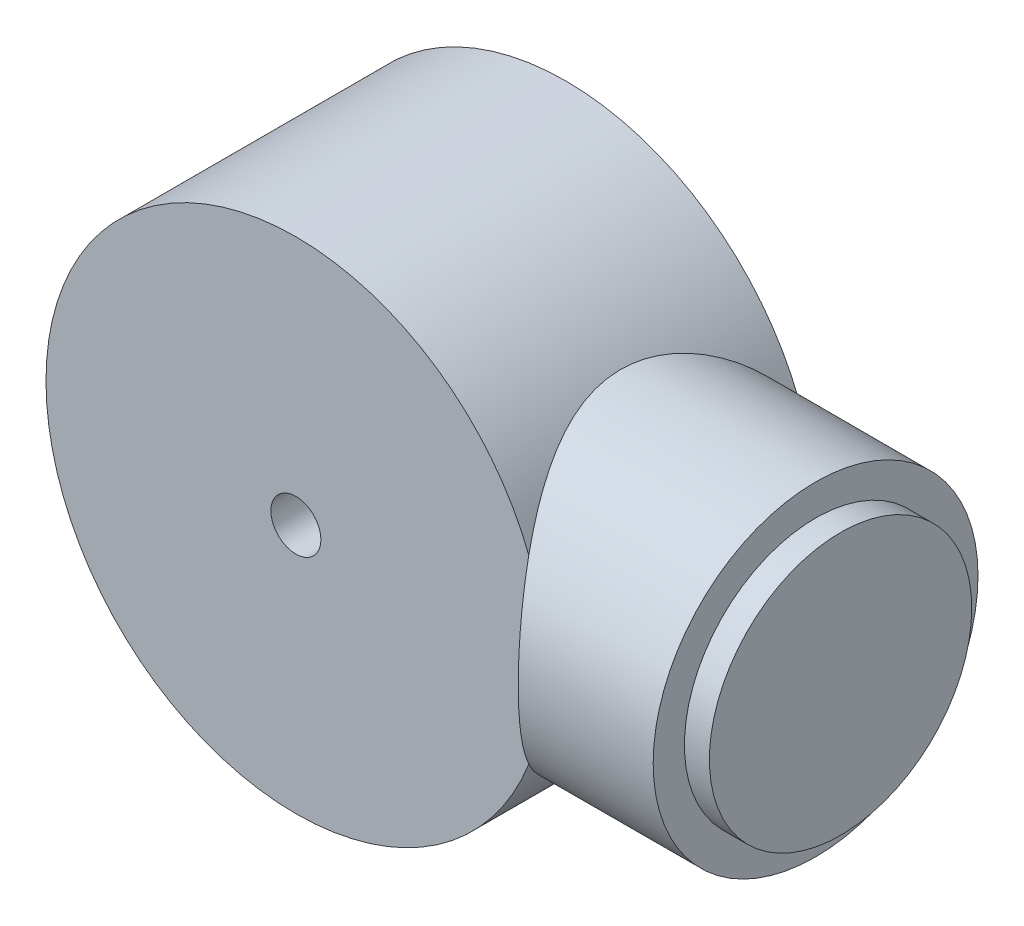
ISO-10303-21;
HEADER;
FILE_DESCRIPTION(('STEP AP214'),'2;1');
FILE_NAME('part.step','',(''),(''),'','','');
FILE_SCHEMA(('AUTOMOTIVE_DESIGN { 1 0 10303 214 1 1 1 1 }'));
ENDSEC;
DATA;
#1=APPLICATION_CONTEXT('core data for automotive mechanical design processes');
#2=APPLICATION_PROTOCOL_DEFINITION('international standard','automotive_design',2000,#1);
#3=PRODUCT_CONTEXT('',#1,'mechanical');
#4=PRODUCT('Part','Part','',(#3));
#5=PRODUCT_RELATED_PRODUCT_CATEGORY('part','',(#4));
#6=PRODUCT_DEFINITION_FORMATION('','',#4);
#7=PRODUCT_DEFINITION_CONTEXT('part definition',#1,'design');
#8=PRODUCT_DEFINITION('design','',#6,#7);
#9=PRODUCT_DEFINITION_SHAPE('','',#8);
#10=(LENGTH_UNIT() NAMED_UNIT(*) SI_UNIT(.MILLI.,.METRE.));
#11=(NAMED_UNIT(*) PLANE_ANGLE_UNIT() SI_UNIT($,.RADIAN.));
#12=(NAMED_UNIT(*) SI_UNIT($,.STERADIAN.) SOLID_ANGLE_UNIT());
#13=UNCERTAINTY_MEASURE_WITH_UNIT(LENGTH_MEASURE(1.E-05),#10,'distance_accuracy_value','');
#14=(GEOMETRIC_REPRESENTATION_CONTEXT(3) GLOBAL_UNCERTAINTY_ASSIGNED_CONTEXT((#13)) GLOBAL_UNIT_ASSIGNED_CONTEXT((#10,
#11,#12)) REPRESENTATION_CONTEXT('',''));
#15=CARTESIAN_POINT('',(0.,0.,0.));
#16=DIRECTION('',(0.,0.,1.));
#17=DIRECTION('',(1.,0.,0.));
#18=AXIS2_PLACEMENT_3D('',#15,#16,#17);
#19=CARTESIAN_POINT('',(0.,0.,54.));
#20=DIRECTION('',(0.,0.,-1.));
#21=DIRECTION('',(-1.,0.,0.));
#22=AXIS2_PLACEMENT_3D('',#19,#20,#21);
#23=CYLINDRICAL_SURFACE('',#22,50.);
#24=CARTESIAN_POINT('',(0.,0.,54.));
#25=DIRECTION('',(0.,0.,1.));
#26=DIRECTION('',(1.,0.,0.));
#27=AXIS2_PLACEMENT_3D('',#24,#25,#26);
#28=CIRCLE('',#27,50.);
#29=CARTESIAN_POINT('',(46.6127664915954,18.0900525151255,54.));
#30=VERTEX_POINT('',#29);
#31=CARTESIAN_POINT('',(46.6127664915954,-18.0900525151255,54.));
#32=VERTEX_POINT('',#31);
#33=EDGE_CURVE('E44',#30,#32,#28,.T.);
#34=ORIENTED_EDGE('',*,*,#33,.F.);
#35=CARTESIAN_POINT('',(50.,0.,-5.5));
#36=CARTESIAN_POINT('',(49.9999950832951,0.820379898340808,-5.49999466046045));
#37=CARTESIAN_POINT('',(49.9797625626082,1.64084726886599,-5.46889183519829));
#38=CARTESIAN_POINT('',(49.8993279047576,3.27517627569682,-5.34493934746414));
#39=CARTESIAN_POINT('',(49.8391202522668,4.08903698480234,-5.25208116466715));
#40=CARTESIAN_POINT('',(49.6801748227282,5.70432342494345,-5.00591516436292));
#41=CARTESIAN_POINT('',(49.5814093942654,6.50573980179267,-4.85256396392356));
#42=CARTESIAN_POINT('',(49.3477186738602,8.08972592140923,-4.48756849820513));
#43=CARTESIAN_POINT('',(49.212794126871,8.87229605208658,-4.2759254338575));
#44=CARTESIAN_POINT('',(48.9105837019917,10.409890979968,-3.79820184570894));
#45=CARTESIAN_POINT('',(48.7434562311797,11.1650299429453,-3.53238743761594));
#46=CARTESIAN_POINT('',(48.3799715633452,12.6475670057983,-2.94868585443072));
#47=CARTESIAN_POINT('',(48.1836142984633,13.3749650412661,-2.63079855844675));
#48=CARTESIAN_POINT('',(47.7655753618638,14.7986574365594,-1.9460483734245));
#49=CARTESIAN_POINT('',(47.5438947789436,15.4949531318671,-1.57918758992853));
#50=CARTESIAN_POINT('',(47.0793256843562,16.853866771853,-0.799477265192811));
#51=CARTESIAN_POINT('',(46.8364361825179,17.5164831418727,-0.38662557654837));
#52=CARTESIAN_POINT('',(46.31288226742,18.8594396012604,0.518300920156271));
#53=CARTESIAN_POINT('',(46.030755539401,19.5366956160193,1.01410599191766));
#54=CARTESIAN_POINT('',(45.4522443941303,20.8472210237898,2.05320041309447));
#55=CARTESIAN_POINT('',(45.1558593389838,21.4804884457185,2.59649188786588));
#56=CARTESIAN_POINT('',(44.5542181709047,22.7021098692218,3.72858800385993));
#57=CARTESIAN_POINT('',(44.2489510586984,23.2904045982318,4.31745071869159));
#58=CARTESIAN_POINT('',(43.635955205152,24.4195865043336,5.53782423965643));
#59=CARTESIAN_POINT('',(43.3282263201168,24.9604708916954,6.16933755157977));
#60=CARTESIAN_POINT('',(42.6711530158535,26.0700560672088,7.57025191176403));
#61=CARTESIAN_POINT('',(42.3224327873107,26.6309119255251,8.34618501317327));
#62=CARTESIAN_POINT('',(41.6406131212886,27.6848953678642,9.94957044777783));
#63=CARTESIAN_POINT('',(41.3075169872343,28.1780086711108,10.7770335907289));
#64=CARTESIAN_POINT('',(40.669017868988,29.0919462219696,12.4796375672601));
#65=CARTESIAN_POINT('',(40.3635774153682,29.5128689906529,13.3547112402174));
#66=CARTESIAN_POINT('',(39.7925815815168,30.2783525612671,15.1499984864518));
#67=CARTESIAN_POINT('',(39.5270080979029,30.6229480570224,16.0701913179829));
#68=CARTESIAN_POINT('',(39.1151707569848,31.1461312138078,17.6898576211882));
#69=CARTESIAN_POINT('',(38.9562369559204,31.3442611136038,18.3798478972654));
#70=CARTESIAN_POINT('',(38.6709512544293,31.695564794545,19.7777927595638));
#71=CARTESIAN_POINT('',(38.5445940631359,31.848745876524,20.4857444080825));
#72=CARTESIAN_POINT('',(38.328980642896,32.1079075043085,21.9148379579285));
#73=CARTESIAN_POINT('',(38.2396737765112,32.213952486247,22.6359604408029));
#74=CARTESIAN_POINT('',(38.1013167187525,32.3774801531489,24.0875823449805));
#75=CARTESIAN_POINT('',(38.0522668939434,32.4349623959195,24.8180818516057));
#76=CARTESIAN_POINT('',(37.9963316864904,32.5004721086949,26.2854803451552));
#77=CARTESIAN_POINT('',(37.9895935697563,32.508326850756,27.0223927537606));
#78=CARTESIAN_POINT('',(38.0189586121582,32.4739783985208,28.4941838153935));
#79=CARTESIAN_POINT('',(38.0550619680412,32.4317749743356,29.2290624590657));
#80=CARTESIAN_POINT('',(38.168648429343,32.298017031725,30.691581698894));
#81=CARTESIAN_POINT('',(38.2461617042717,32.2064265315171,31.4192166233723));
#82=CARTESIAN_POINT('',(38.43953216099,31.9753805209268,32.8616220334858));
#83=CARTESIAN_POINT('',(38.5553901243586,31.8359240348907,33.5763922565868));
#84=CARTESIAN_POINT('',(38.8165742872301,31.5168911106297,34.9639466936341));
#85=CARTESIAN_POINT('',(38.9607173353993,31.33890276179,35.6373226704315));
#86=CARTESIAN_POINT('',(39.2765368375223,30.9421702821062,36.9655787328999));
#87=CARTESIAN_POINT('',(39.4482240312041,30.7234102485866,37.6204514863652));
#88=CARTESIAN_POINT('',(39.8145826406525,30.247135742793,38.9093625725826));
#89=CARTESIAN_POINT('',(40.0092566397756,29.9896169137431,39.5433985533529));
#90=CARTESIAN_POINT('',(40.4170288058455,29.4377556466839,40.7888514561042));
#91=CARTESIAN_POINT('',(40.6301227285746,29.1434216844657,41.4002735425394));
#92=CARTESIAN_POINT('',(41.1140079381856,28.457817543033,42.7180777586586));
#93=CARTESIAN_POINT('',(41.3878797638847,28.0588852943435,43.4193502974399));
#94=CARTESIAN_POINT('',(41.949038749162,27.2127893027469,44.7865262043896));
#95=CARTESIAN_POINT('',(42.2363271724089,26.7656210114159,45.452426228251));
#96=CARTESIAN_POINT('',(42.8182561243996,25.8244717865271,46.7481253404724));
#97=CARTESIAN_POINT('',(43.1129043018876,25.330440520131,47.3778844200849));
#98=CARTESIAN_POINT('',(43.7033294929278,24.2975913742116,48.5989955295088));
#99=CARTESIAN_POINT('',(43.9991065762731,23.7587706814012,49.1903451426055));
#100=CARTESIAN_POINT('',(44.6433757161103,22.5286511323823,50.4440586838091));
#101=CARTESIAN_POINT('',(44.9909276528173,21.8280825337455,51.0978541444607));
#102=CARTESIAN_POINT('',(45.6707389230497,20.3674410882344,52.3444130595286));
#103=CARTESIAN_POINT('',(46.0029955959866,19.6073579505351,52.9371659176914));
#104=CARTESIAN_POINT('',(46.6432717696123,18.0313075910058,54.0565210365045));
#105=CARTESIAN_POINT('',(46.9513108856265,17.2153866190105,54.5831770437384));
#106=CARTESIAN_POINT('',(47.5350545534779,15.531013891883,55.5654939457799));
#107=CARTESIAN_POINT('',(47.8107680817938,14.6625768219423,56.0211745613144));
#108=CARTESIAN_POINT('',(48.2712989219017,13.0551073362084,56.773110475653));
#109=CARTESIAN_POINT('',(48.4633033177363,12.324514168495,57.0830659962705));
#110=CARTESIAN_POINT('',(48.8176192333411,10.8362739804481,57.6505975880767));
#111=CARTESIAN_POINT('',(48.979934361987,10.0786302616407,57.9081800258954));
#112=CARTESIAN_POINT('',(49.2713253417834,8.54098217221501,58.3678991154421));
#113=CARTESIAN_POINT('',(49.4004230450817,7.76099287899599,58.5700722240386));
#114=CARTESIAN_POINT('',(49.6226053964351,6.18317573262193,58.9166205684597));
#115=CARTESIAN_POINT('',(49.7156894160999,5.38534756845951,59.0609947957731));
#116=CARTESIAN_POINT('',(49.8639036202448,3.77460108589335,59.2903482323196));
#117=CARTESIAN_POINT('',(49.9188902972156,2.9616374291221,59.3751028808245));
#118=CARTESIAN_POINT('',(49.9889806039512,1.32990448445416,59.4830706056691));
#119=CARTESIAN_POINT('',(50.0040842099017,0.511135193091196,59.506283645262));
#120=CARTESIAN_POINT('',(49.9940280170243,-1.12558702772942,59.4908120509778));
#121=CARTESIAN_POINT('',(49.9688671194818,-1.9435399343006,59.4521257280265));
#122=CARTESIAN_POINT('',(49.8789112577068,-3.57199749573233,59.3134426463783));
#123=CARTESIAN_POINT('',(49.8141175484482,-4.38250238560966,59.2134478290158));
#124=CARTESIAN_POINT('',(49.6514918470381,-5.94197489256988,58.9613719584213));
#125=CARTESIAN_POINT('',(49.555854505623,-6.6917350268788,58.8127432372991));
#126=CARTESIAN_POINT('',(49.3329577485776,-8.1744282627694,58.4644026294863));
#127=CARTESIAN_POINT('',(49.2056998557011,-8.907362172797,58.2646932026805));
#128=CARTESIAN_POINT('',(48.9220905433369,-10.3523561917551,57.8164089830273));
#129=CARTESIAN_POINT('',(48.7657373107556,-11.0644149966383,57.5678311448613));
#130=CARTESIAN_POINT('',(48.4268841832775,-12.4641703227049,57.0242943573914));
#131=CARTESIAN_POINT('',(48.2443828654948,-13.1518655155656,56.7293328839699));
#132=CARTESIAN_POINT('',(47.8429790386047,-14.5468935746808,56.0735703190451));
#133=CARTESIAN_POINT('',(47.6224282140744,-15.2522697974981,55.7096182026578));
#134=CARTESIAN_POINT('',(47.1593126222709,-16.629097865148,54.9346965691568));
#135=CARTESIAN_POINT('',(46.9167470587903,-17.3005484816245,54.5237253513626));
#136=CARTESIAN_POINT('',(46.4138194489232,-18.607742420822,53.6574027719117));
#137=CARTESIAN_POINT('',(46.1534470794155,-19.2434646350104,53.2020256005709));
#138=CARTESIAN_POINT('',(45.619526143917,-20.4770764710835,52.2496858797039));
#139=CARTESIAN_POINT('',(45.3459768617906,-21.074964032645,51.7527210688985));
#140=CARTESIAN_POINT('',(44.7471563176791,-22.3213173683831,50.6391921817521));
#141=CARTESIAN_POINT('',(44.4204496488134,-22.9632199419752,50.0160396905248));
#142=CARTESIAN_POINT('',(43.7630045869561,-24.1926746957852,48.7200933671887));
#143=CARTESIAN_POINT('',(43.4322656332202,-24.7802192169113,48.047292563529));
#144=CARTESIAN_POINT('',(42.7745161992376,-25.8990740511106,46.6541722015348));
#145=CARTESIAN_POINT('',(42.4475074152823,-26.4303596241356,45.9338319617479));
#146=CARTESIAN_POINT('',(41.8059041408205,-27.4339387672869,44.4479953540767));
#147=CARTESIAN_POINT('',(41.4913079318813,-27.906240523045,43.6825052737353));
#148=CARTESIAN_POINT('',(40.9200564815249,-28.7362441351099,42.2022955754751));
#149=CARTESIAN_POINT('',(40.6609659921665,-29.1008956870287,41.4924109597111));
#150=CARTESIAN_POINT('',(40.1664965087985,-29.779672463042,40.0408179524925));
#151=CARTESIAN_POINT('',(39.9311170218804,-30.0937987375458,39.2991102230396));
#152=CARTESIAN_POINT('',(39.4917120575915,-30.6681484086005,37.7873745813625));
#153=CARTESIAN_POINT('',(39.287640214774,-30.9284517177363,37.0173906827655));
#154=CARTESIAN_POINT('',(38.9178700773443,-31.3924770297742,35.4515519018164));
#155=CARTESIAN_POINT('',(38.7521647978538,-31.5962093331374,34.6557017587133));
#156=CARTESIAN_POINT('',(38.487621867937,-31.9176987315613,33.1645325250141));
#157=CARTESIAN_POINT('',(38.3824721686329,-32.0437830280959,32.4721239485102));
#158=CARTESIAN_POINT('',(38.2084463267924,-32.2510939378217,31.0761112799988));
#159=CARTESIAN_POINT('',(38.139566259711,-32.3323254043466,30.3725084077581));
#160=CARTESIAN_POINT('',(38.0406628594831,-32.4486339223221,28.95921823179));
#161=CARTESIAN_POINT('',(38.0106142233053,-32.4837410292135,28.2495351938049));
#162=CARTESIAN_POINT('',(37.9904569091207,-32.5073136396741,26.8288028909469));
#163=CARTESIAN_POINT('',(38.0003490888071,-32.495778141635,26.1177535970627));
#164=CARTESIAN_POINT('',(38.059663883183,-32.4262861105484,24.700175772028));
#165=CARTESIAN_POINT('',(38.1090550774856,-32.368366474764,23.9936440973489));
#166=CARTESIAN_POINT('',(38.2454441231086,-32.2070967599132,22.5895137156665));
#167=CARTESIAN_POINT('',(38.3324416199641,-32.1037471090554,21.8919149245286));
#168=CARTESIAN_POINT('',(38.5410535221566,-31.8530019051811,20.509194774244));
#169=CARTESIAN_POINT('',(38.662705517609,-31.7055585145022,19.824087828478));
#170=CARTESIAN_POINT('',(38.9366337080108,-31.3685451393114,18.4705803278069));
#171=CARTESIAN_POINT('',(39.0889139006484,-31.1789696552474,17.8021819665759));
#172=CARTESIAN_POINT('',(39.4681515862117,-30.6982762499881,16.291855828066));
#173=CARTESIAN_POINT('',(39.7039201757252,-30.3936788069919,15.4564089668611));
#174=CARTESIAN_POINT('',(40.2095373547831,-29.721538113857,13.821926549327));
#175=CARTESIAN_POINT('',(40.4793956364613,-29.3539769517075,13.0229014364316));
#176=CARTESIAN_POINT('',(41.0440210917243,-28.5591694410698,11.4632462946186));
#177=CARTESIAN_POINT('',(41.3388144790771,-28.1318599644147,10.7026580493571));
#178=CARTESIAN_POINT('',(41.9442700701395,-27.2208981243104,9.22283282769884));
#179=CARTESIAN_POINT('',(42.2549313196396,-26.7372491465867,8.50359337032016));
#180=CARTESIAN_POINT('',(42.8889875449583,-25.7080858845502,7.09735699713856));
#181=CARTESIAN_POINT('',(43.2125052568565,-25.1617288893835,6.41103263250462));
#182=CARTESIAN_POINT('',(43.8598896717567,-24.0154817005351,5.0848268798128));
#183=CARTESIAN_POINT('',(44.1837563765708,-23.4155912275827,4.4449457340691));
#184=CARTESIAN_POINT('',(44.8246827044135,-22.1639850361142,3.2139037879028));
#185=CARTESIAN_POINT('',(45.1417405445902,-21.5122559491886,2.62275563555921));
#186=CARTESIAN_POINT('',(45.7620737335855,-20.1590357237669,1.49234233674686));
#187=CARTESIAN_POINT('',(46.0653483829597,-19.4575420645242,0.953079821728656));
#188=CARTESIAN_POINT('',(46.6810020521624,-17.9339091298916,-0.121560308825123));
#189=CARTESIAN_POINT('',(46.991220745991,-17.1067350387869,-0.651074470906869));
#190=CARTESIAN_POINT('',(47.5783138826708,-15.3986971256461,-1.63744016453904));
#191=CARTESIAN_POINT('',(47.855183285751,-14.5178252189714,-2.09428071693315));
#192=CARTESIAN_POINT('',(48.3668793423392,-12.7092691977611,-2.92847198378674));
#193=CARTESIAN_POINT('',(48.6017836772997,-11.7816757386604,-3.30596980304276));
#194=CARTESIAN_POINT('',(48.917289614073,-10.3602514667507,-3.80857072157964));
#195=CARTESIAN_POINT('',(49.016307598532,-9.88149221910737,-3.96548291174638));
#196=CARTESIAN_POINT('',(49.2013116274098,-8.91476468347579,-4.25750903195082));
#197=CARTESIAN_POINT('',(49.2872955229403,-8.42679489185499,-4.39261936782316));
#198=CARTESIAN_POINT('',(49.4696847366718,-7.29205135260537,-4.67830917492835));
#199=CARTESIAN_POINT('',(49.561201378512,-6.6424628353478,-4.82092889076201));
#200=CARTESIAN_POINT('',(49.7191592253278,-5.33292853081827,-5.06639380811066));
#201=CARTESIAN_POINT('',(49.7856047759838,-4.67298455917691,-5.1692459027954));
#202=CARTESIAN_POINT('',(49.8923502038399,-3.34607343613181,-5.33420136120816));
#203=CARTESIAN_POINT('',(49.9326568726316,-2.67910815486154,-5.39631530986083));
#204=CARTESIAN_POINT('',(49.9864860599114,-1.3414484839905,-5.47922032849765));
#205=CARTESIAN_POINT('',(50.0000040199631,-0.670753479198282,-5.50000436567832));
#206=CARTESIAN_POINT('',(50.,0.,-5.5));
#207=B_SPLINE_CURVE_WITH_KNOTS('',3,(#35,#36,#37,#38,#39,#40,#41,#42,#43,#44,#45,#46,#47,#48,
#49,#50,#51,#52,#53,#54,#55,#56,#57,#58,#59,#60,#61,#62,#63,#64,#65,#66,#67,#68,#69,#70,#71,#72,
#73,#74,#75,#76,#77,#78,#79,#80,#81,#82,#83,#84,#85,#86,#87,#88,#89,#90,#91,#92,#93,#94,#95,#96,
#97,#98,#99,#100,#101,#102,#103,#104,#105,#106,#107,#108,#109,#110,#111,#112,#113,#114,#115,
#116,#117,#118,#119,#120,#121,#122,#123,#124,#125,#126,#127,#128,#129,#130,#131,#132,#133,#134,
#135,#136,#137,#138,#139,#140,#141,#142,#143,#144,#145,#146,#147,#148,#149,#150,#151,#152,#153,
#154,#155,#156,#157,#158,#159,#160,#161,#162,#163,#164,#165,#166,#167,#168,#169,#170,#171,#172,
#173,#174,#175,#176,#177,#178,#179,#180,#181,#182,#183,#184,#185,#186,#187,#188,#189,#190,#191,
#192,#193,#194,#195,#196,#197,#198,#199,#200,#201,#202,#203,#204,#205,#206),.UNSPECIFIED.,.T.,
.F.,(4,2,2,2,2,2,2,2,2,2,2,2,2,2,2,2,2,2,2,2,2,2,2,2,2,2,2,2,2,2,2,2,2,2,2,2,2,2,2,2,2,2,2,2,2,
2,2,2,2,2,2,2,2,2,2,2,2,2,2,2,2,2,2,2,2,2,2,2,2,2,2,2,2,2,2,2,2,2,2,2,2,2,2,2,2,4),(0.,
2.46045993003765,4.92125939771797,7.38382686034164,9.84634359284154,12.2970428769451,
14.7477478506417,17.1983474938338,19.6490616082808,22.3029292718831,24.9569157759163,
27.6143419106252,30.2719243093767,33.3251156223354,36.3789495926578,39.4285821341122,
42.4768256369194,44.6805266408034,46.8838695090903,49.0841910232989,51.2845325725393,
53.4925281856819,55.7005339389497,57.9101505497284,60.1198122018549,62.2515577277178,
64.3841364708946,66.5169551110068,68.6492836220793,71.2029639599345,73.7568853082476,
76.3135814239511,78.8704382508673,81.9247620382729,84.9796151285971,88.031967848395,
91.0834709439921,93.5305607781958,95.9773529586959,98.4225313729449,100.867752450345,
103.322134985925,105.776518987026,108.230969963086,110.685343222929,112.993712174889,
115.301969984042,117.61037168185,119.918899042404,122.38786060554,124.85691149924,
127.327406109676,129.798035137756,132.652317947386,135.507002317129,138.362936875042,
141.218474651779,143.733409825373,146.248292707263,148.759414421274,151.270078609418,
153.402630947015,155.534952484961,157.665883874566,159.796861024257,161.926144723967,
164.055408354167,166.186990472554,168.318850992474,171.074796064786,173.83152645837,
176.591191849729,179.35069148432,182.152963084706,184.955249304694,187.758260550462,
190.5614138799,193.646940868185,196.73293356028,199.813153211307,201.352923022289,
202.892946414719,204.905180739947,206.91706611552,208.928428538954,210.940133191687),.UNSPECIFIED.);
#208=CARTESIAN_POINT('',(46.6127664915954,18.0900525151255,0.));
#209=VERTEX_POINT('',#208);
#210=EDGE_CURVE('E72',#209,#30,#207,.T.);
#211=ORIENTED_EDGE('',*,*,#210,.F.);
#212=CARTESIAN_POINT('',(0.,0.,0.));
#213=DIRECTION('',(0.,0.,1.));
#214=DIRECTION('',(1.,0.,0.));
#215=AXIS2_PLACEMENT_3D('',#212,#213,#214);
#216=CIRCLE('',#215,50.);
#217=CARTESIAN_POINT('',(46.6127664915954,-18.0900525151255,0.));
#218=VERTEX_POINT('',#217);
#219=EDGE_CURVE('E65',#209,#218,#216,.T.);
#220=ORIENTED_EDGE('',*,*,#219,.T.);
#221=EDGE_CURVE('E52',#32,#218,#207,.T.);
#222=ORIENTED_EDGE('',*,*,#221,.F.);
#223=EDGE_LOOP('',(#34,#211,#220,#222));
#224=FACE_BOUND('',#223,.T.);
#225=ADVANCED_FACE('F36',(#224),#23,.T.);
#226=CARTESIAN_POINT('',(0.,0.,54.));
#227=DIRECTION('',(0.,0.,1.));
#228=DIRECTION('',(1.,0.,0.));
#229=AXIS2_PLACEMENT_3D('',#226,#227,#228);
#230=PLANE('',#229);
#231=CARTESIAN_POINT('',(0.,0.,54.));
#232=DIRECTION('',(0.,0.,1.));
#233=DIRECTION('',(1.,0.,0.));
#234=AXIS2_PLACEMENT_3D('',#231,#232,#233);
#235=CIRCLE('',#234,5.);
#236=CARTESIAN_POINT('',(5.,0.,54.));
#237=VERTEX_POINT('',#236);
#238=EDGE_CURVE('E131',#237,#237,#235,.T.);
#239=ORIENTED_EDGE('',*,*,#238,.F.);
#240=EDGE_LOOP('',(#239));
#241=FACE_BOUND('',#240,.T.);
#242=ORIENTED_EDGE('',*,*,#33,.T.);
#243=CARTESIAN_POINT('',(0.,0.,54.));
#244=DIRECTION('',(0.,0.,1.));
#245=DIRECTION('',(1.,0.,0.));
#246=AXIS2_PLACEMENT_3D('',#243,#244,#245);
#247=CIRCLE('',#246,50.);
#248=EDGE_CURVE('E58',#30,#32,#247,.F.);
#249=ORIENTED_EDGE('',*,*,#248,.F.);
#250=EDGE_LOOP('',(#242,#249));
#251=FACE_BOUND('',#250,.T.);
#252=ADVANCED_FACE('F121',(#241,#251),#230,.T.);
#253=CARTESIAN_POINT('',(0.,0.,0.));
#254=DIRECTION('',(0.,0.,1.));
#255=DIRECTION('',(1.,0.,0.));
#256=AXIS2_PLACEMENT_3D('',#253,#254,#255);
#257=PLANE('',#256);
#258=CARTESIAN_POINT('',(0.,0.,0.));
#259=DIRECTION('',(0.,0.,1.));
#260=DIRECTION('',(1.,0.,0.));
#261=AXIS2_PLACEMENT_3D('',#258,#259,#260);
#262=CIRCLE('',#261,5.);
#263=CARTESIAN_POINT('',(5.,0.,0.));
#264=VERTEX_POINT('',#263);
#265=EDGE_CURVE('E39',#264,#264,#262,.T.);
#266=ORIENTED_EDGE('',*,*,#265,.T.);
#267=EDGE_LOOP('',(#266));
#268=FACE_BOUND('',#267,.T.);
#269=ORIENTED_EDGE('',*,*,#219,.F.);
#270=EDGE_CURVE('E69',#218,#209,#216,.T.);
#271=ORIENTED_EDGE('',*,*,#270,.F.);
#272=EDGE_LOOP('',(#269,#271));
#273=FACE_BOUND('',#272,.T.);
#274=ADVANCED_FACE('F67',(#268,#273),#257,.F.);
#275=CARTESIAN_POINT('',(0.,0.,54.));
#276=DIRECTION('',(0.,0.,-1.));
#277=DIRECTION('',(-1.,0.,0.));
#278=AXIS2_PLACEMENT_3D('',#275,#276,#277);
#279=CYLINDRICAL_SURFACE('',#278,50.);
#280=ORIENTED_EDGE('',*,*,#270,.T.);
#281=EDGE_CURVE('E79',#218,#209,#207,.T.);
#282=ORIENTED_EDGE('',*,*,#281,.F.);
#283=EDGE_LOOP('',(#280,#282));
#284=FACE_BOUND('',#283,.T.);
#285=ADVANCED_FACE('F81',(#284),#279,.F.);
#286=CARTESIAN_POINT('',(77.,0.,27.));
#287=DIRECTION('',(1.,0.,0.));
#288=DIRECTION('',(0.,0.,-1.));
#289=AXIS2_PLACEMENT_3D('',#286,#287,#288);
#290=PLANE('',#289);
#291=CARTESIAN_POINT('',(77.,0.,27.));
#292=DIRECTION('',(1.,0.,0.));
#293=DIRECTION('',(0.,0.,-1.));
#294=AXIS2_PLACEMENT_3D('',#291,#292,#293);
#295=CIRCLE('',#294,26.25);
#296=CARTESIAN_POINT('',(77.,0.,0.750000000000001));
#297=VERTEX_POINT('',#296);
#298=EDGE_CURVE('E11',#297,#297,#295,.T.);
#299=ORIENTED_EDGE('',*,*,#298,.F.);
#300=EDGE_LOOP('',(#299));
#301=FACE_BOUND('',#300,.T.);
#302=CARTESIAN_POINT('',(77.,0.,27.));
#303=DIRECTION('',(1.,0.,0.));
#304=DIRECTION('',(0.,0.,-1.));
#305=AXIS2_PLACEMENT_3D('',#302,#303,#304);
#306=CIRCLE('',#305,32.5);
#307=CARTESIAN_POINT('',(77.,0.,-5.5));
#308=VERTEX_POINT('',#307);
#309=EDGE_CURVE('E83',#308,#308,#306,.T.);
#310=ORIENTED_EDGE('',*,*,#309,.T.);
#311=EDGE_LOOP('',(#310));
#312=FACE_BOUND('',#311,.T.);
#313=ADVANCED_FACE('F102',(#301,#312),#290,.T.);
#314=CARTESIAN_POINT('',(-50.001,0.,27.));
#315=DIRECTION('',(1.,0.,0.));
#316=DIRECTION('',(0.,0.,-1.));
#317=AXIS2_PLACEMENT_3D('',#314,#315,#316);
#318=CYLINDRICAL_SURFACE('',#317,32.5);
#319=ORIENTED_EDGE('',*,*,#309,.F.);
#320=EDGE_LOOP('',(#319));
#321=FACE_BOUND('',#320,.T.);
#322=ORIENTED_EDGE('',*,*,#210,.T.);
#323=EDGE_CURVE('E77',#30,#32,#207,.T.);
#324=ORIENTED_EDGE('',*,*,#323,.T.);
#325=ORIENTED_EDGE('',*,*,#221,.T.);
#326=ORIENTED_EDGE('',*,*,#281,.T.);
#327=EDGE_LOOP('',(#322,#324,#325,#326));
#328=FACE_BOUND('',#327,.T.);
#329=ADVANCED_FACE('F82',(#321,#328),#318,.T.);
#330=ORIENTED_EDGE('',*,*,#323,.F.);
#331=ORIENTED_EDGE('',*,*,#248,.T.);
#332=EDGE_LOOP('',(#330,#331));
#333=FACE_BOUND('',#332,.T.);
#334=ADVANCED_FACE('F96',(#333),#279,.F.);
#335=CARTESIAN_POINT('',(82.,0.,27.));
#336=DIRECTION('',(-1.,0.,0.));
#337=DIRECTION('',(0.,0.,1.));
#338=AXIS2_PLACEMENT_3D('',#335,#336,#337);
#339=CYLINDRICAL_SURFACE('',#338,26.25);
#340=CARTESIAN_POINT('',(82.,0.,27.));
#341=DIRECTION('',(1.,0.,0.));
#342=DIRECTION('',(0.,0.,-1.));
#343=AXIS2_PLACEMENT_3D('',#340,#341,#342);
#344=CIRCLE('',#343,26.25);
#345=CARTESIAN_POINT('',(82.,0.,0.750000000000001));
#346=VERTEX_POINT('',#345);
#347=EDGE_CURVE('E85',#346,#346,#344,.T.);
#348=ORIENTED_EDGE('',*,*,#347,.F.);
#349=EDGE_LOOP('',(#348));
#350=FACE_BOUND('',#349,.T.);
#351=ORIENTED_EDGE('',*,*,#298,.T.);
#352=EDGE_LOOP('',(#351));
#353=FACE_BOUND('',#352,.T.);
#354=ADVANCED_FACE('F100',(#350,#353),#339,.T.);
#355=CARTESIAN_POINT('',(82.,0.,27.));
#356=DIRECTION('',(1.,0.,0.));
#357=DIRECTION('',(0.,0.,-1.));
#358=AXIS2_PLACEMENT_3D('',#355,#356,#357);
#359=PLANE('',#358);
#360=ORIENTED_EDGE('',*,*,#347,.T.);
#361=EDGE_LOOP('',(#360));
#362=FACE_BOUND('',#361,.T.);
#363=ADVANCED_FACE('F108',(#362),#359,.T.);
#364=CARTESIAN_POINT('',(0.,0.,-446.));
#365=DIRECTION('',(0.,0.,1.));
#366=DIRECTION('',(1.,0.,0.));
#367=AXIS2_PLACEMENT_3D('',#364,#365,#366);
#368=CYLINDRICAL_SURFACE('',#367,5.);
#369=ORIENTED_EDGE('',*,*,#238,.T.);
#370=EDGE_LOOP('',(#369));
#371=FACE_BOUND('',#370,.T.);
#372=ORIENTED_EDGE('',*,*,#265,.F.);
#373=EDGE_LOOP('',(#372));
#374=FACE_BOUND('',#373,.T.);
#375=ADVANCED_FACE('F112',(#371,#374),#368,.F.);
#376=CLOSED_SHELL('',(#225,#252,#274,#285,#313,#329,#334,#354,#363,#375));
#377=MANIFOLD_SOLID_BREP('B2',#376);
#378=ADVANCED_BREP_SHAPE_REPRESENTATION('',(#18,#377),#14);
#379=SHAPE_DEFINITION_REPRESENTATION(#9,#378);
ENDSEC;
END-ISO-10303-21;
